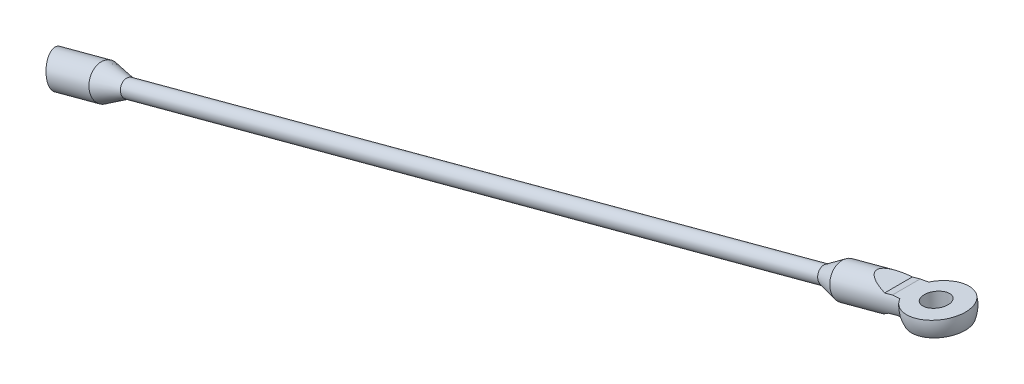
ISO-10303-21;
HEADER;
FILE_DESCRIPTION(('STEP AP214'),'2;1');
FILE_NAME('part.step','',(''),(''),'','','');
FILE_SCHEMA(('AUTOMOTIVE_DESIGN { 1 0 10303 214 1 1 1 1 }'));
ENDSEC;
DATA;
#1=APPLICATION_CONTEXT('core data for automotive mechanical design processes');
#2=APPLICATION_PROTOCOL_DEFINITION('international standard','automotive_design',2000,#1);
#3=PRODUCT_CONTEXT('',#1,'mechanical');
#4=PRODUCT('Part','Part','',(#3));
#5=PRODUCT_RELATED_PRODUCT_CATEGORY('part','',(#4));
#6=PRODUCT_DEFINITION_FORMATION('','',#4);
#7=PRODUCT_DEFINITION_CONTEXT('part definition',#1,'design');
#8=PRODUCT_DEFINITION('design','',#6,#7);
#9=PRODUCT_DEFINITION_SHAPE('','',#8);
#10=(LENGTH_UNIT() NAMED_UNIT(*) SI_UNIT(.MILLI.,.METRE.));
#11=(NAMED_UNIT(*) PLANE_ANGLE_UNIT() SI_UNIT($,.RADIAN.));
#12=(NAMED_UNIT(*) SI_UNIT($,.STERADIAN.) SOLID_ANGLE_UNIT());
#13=UNCERTAINTY_MEASURE_WITH_UNIT(LENGTH_MEASURE(1.E-05),#10,'distance_accuracy_value','');
#14=(GEOMETRIC_REPRESENTATION_CONTEXT(3) GLOBAL_UNCERTAINTY_ASSIGNED_CONTEXT((#13)) GLOBAL_UNIT_ASSIGNED_CONTEXT((#10,
#11,#12)) REPRESENTATION_CONTEXT('',''));
#15=CARTESIAN_POINT('',(0.,0.,0.));
#16=DIRECTION('',(0.,0.,1.));
#17=DIRECTION('',(1.,0.,0.));
#18=AXIS2_PLACEMENT_3D('',#15,#16,#17);
#19=CARTESIAN_POINT('',(1.78943870287719,-13.592136386849,0.));
#20=DIRECTION('',(-0.965925826289068,-0.258819045102522,0.));
#21=DIRECTION('',(0.,0.,1.));
#22=AXIS2_PLACEMENT_3D('',#19,#20,#21);
#23=CYLINDRICAL_SURFACE('',#22,1.);
#24=CARTESIAN_POINT('',(52.320746510658,-0.0523132672655552,0.));
#25=DIRECTION('',(0.965925826289068,0.258819045102522,0.));
#26=DIRECTION('',(0.,0.,1.));
#27=AXIS2_PLACEMENT_3D('',#24,#25,#26);
#28=CIRCLE('',#27,1.);
#29=CARTESIAN_POINT('',(52.320746510658,-0.0523132672655552,1.));
#30=VERTEX_POINT('',#29);
#31=EDGE_CURVE('E132',#30,#30,#28,.T.);
#32=ORIENTED_EDGE('',*,*,#31,.T.);
#33=EDGE_LOOP('',(#32));
#34=FACE_BOUND('',#33,.T.);
#35=CARTESIAN_POINT('',(52.5159822820029,0.,0.));
#36=DIRECTION('',(-0.130526192220052,0.99144486137381,0.));
#37=DIRECTION('',(-0.99144486137381,-0.130526192220052,0.));
#38=AXIS2_PLACEMENT_3D('',#35,#36,#37);
#39=ELLIPSE('',#38,7.66129757554036,1.);
#40=CARTESIAN_POINT('',(56.3138593383655,0.499999999999999,0.86602540378444));
#41=VERTEX_POINT('',#40);
#42=CARTESIAN_POINT('',(56.8138593383655,0.565826248793698,0.824524503078021));
#43=VERTEX_POINT('',#42);
#44=EDGE_CURVE('E127',#41,#43,#39,.T.);
#45=ORIENTED_EDGE('',*,*,#44,.T.);
#46=CARTESIAN_POINT('',(56.6674127289588,1.11237243569579,0.));
#47=DIRECTION('',(0.965925826289068,0.258819045102522,0.));
#48=DIRECTION('',(0.,0.,1.));
#49=AXIS2_PLACEMENT_3D('',#46,#47,#48);
#50=CIRCLE('',#49,1.);
#51=CARTESIAN_POINT('',(56.555040293263,1.53175207508277,0.900829147931753));
#52=VERTEX_POINT('',#51);
#53=EDGE_CURVE('E105',#52,#43,#50,.T.);
#54=ORIENTED_EDGE('',*,*,#53,.F.);
#55=CARTESIAN_POINT('',(59.8529173496255,1.96592582628907,0.));
#56=DIRECTION('',(0.130526192220052,-0.99144486137381,0.));
#57=DIRECTION('',(-0.99144486137381,-0.130526192220052,0.));
#58=AXIS2_PLACEMENT_3D('',#55,#56,#57);
#59=ELLIPSE('',#58,7.66129757554037,1.);
#60=CARTESIAN_POINT('',(56.055040293263,1.46592582628907,0.866025403784439));
#61=VERTEX_POINT('',#60);
#62=EDGE_CURVE('E117',#52,#61,#59,.T.);
#63=ORIENTED_EDGE('',*,*,#62,.T.);
#64=DIRECTION('',(-0.965925826289068,-0.258819045102522,0.));
#65=VECTOR('',#64,1.);
#66=CARTESIAN_POINT('',(1.66002918032593,-13.1091734737044,0.866025403784439));
#67=LINE('',#66,#65);
#68=CARTESIAN_POINT('',(55.5720773801184,1.33651630373781,0.866025403784443));
#69=VERTEX_POINT('',#68);
#70=EDGE_CURVE('E160',#61,#69,#67,.T.);
#71=ORIENTED_EDGE('',*,*,#70,.T.);
#72=CARTESIAN_POINT('',(56.908894185531,1.17707719697142,0.));
#73=DIRECTION('',(-0.118428395398521,-0.992962595047433,0.));
#74=DIRECTION('',(-0.992962595047433,0.118428395398521,0.));
#75=AXIS2_PLACEMENT_3D('',#72,#73,#74);
#76=ELLIPSE('',#75,2.69258240356725,1.);
#77=CARTESIAN_POINT('',(55.5720773801184,1.33651630373781,-0.866025403784443));
#78=VERTEX_POINT('',#77);
#79=EDGE_CURVE('E152',#69,#78,#76,.T.);
#80=ORIENTED_EDGE('',*,*,#79,.T.);
#81=DIRECTION('',(-0.965925826289068,-0.258819045102522,0.));
#82=VECTOR('',#81,1.);
#83=CARTESIAN_POINT('',(1.66002918032593,-13.1091734737044,-0.866025403784439));
#84=LINE('',#83,#82);
#85=CARTESIAN_POINT('',(56.055040293263,1.46592582628907,-0.866025403784439));
#86=VERTEX_POINT('',#85);
#87=EDGE_CURVE('E156',#78,#86,#84,.F.);
#88=ORIENTED_EDGE('',*,*,#87,.T.);
#89=CARTESIAN_POINT('',(56.555040293263,1.53175207508277,-0.900829147931753));
#90=VERTEX_POINT('',#89);
#91=EDGE_CURVE('E124',#86,#90,#59,.T.);
#92=ORIENTED_EDGE('',*,*,#91,.T.);
#93=CARTESIAN_POINT('',(56.8138593383655,0.565826248793698,-0.824524503078021));
#94=VERTEX_POINT('',#93);
#95=EDGE_CURVE('E108',#94,#90,#50,.T.);
#96=ORIENTED_EDGE('',*,*,#95,.F.);
#97=CARTESIAN_POINT('',(56.3138593383655,0.499999999999999,-0.866025403784429));
#98=VERTEX_POINT('',#97);
#99=EDGE_CURVE('E133',#94,#98,#39,.T.);
#100=ORIENTED_EDGE('',*,*,#99,.T.);
#101=DIRECTION('',(-0.965925826289068,-0.258819045102522,0.));
#102=VECTOR('',#101,1.);
#103=CARTESIAN_POINT('',(1.91884822542845,-14.0750992999935,-0.86602540378444));
#104=LINE('',#103,#102);
#105=CARTESIAN_POINT('',(55.830896425221,0.370590477448737,-0.86602540378444));
#106=VERTEX_POINT('',#105);
#107=EDGE_CURVE('E163',#98,#106,#104,.T.);
#108=ORIENTED_EDGE('',*,*,#107,.T.);
#109=CARTESIAN_POINT('',(56.908894185531,1.17707719697142,0.));
#110=DIRECTION('',(-0.599043296468266,0.800716634619535,0.));
#111=DIRECTION('',(-0.800716634619535,-0.599043296468266,0.));
#112=AXIS2_PLACEMENT_3D('',#109,#110,#111);
#113=ELLIPSE('',#112,2.69258240356725,1.);
#114=CARTESIAN_POINT('',(55.830896425221,0.370590477448737,0.866025403784429));
#115=VERTEX_POINT('',#114);
#116=EDGE_CURVE('E167',#106,#115,#113,.T.);
#117=ORIENTED_EDGE('',*,*,#116,.T.);
#118=DIRECTION('',(-0.965925826289068,-0.258819045102522,0.));
#119=VECTOR('',#118,1.);
#120=CARTESIAN_POINT('',(1.91884822542845,-14.0750992999935,0.86602540378444));
#121=LINE('',#120,#119);
#122=EDGE_CURVE('E56',#115,#41,#121,.F.);
#123=ORIENTED_EDGE('',*,*,#122,.T.);
#124=EDGE_LOOP('',(#45,#54,#63,#71,#80,#88,#92,#96,#100,#108,#117,#123));
#125=FACE_BOUND('',#124,.T.);
#126=ADVANCED_FACE('F47',(#34,#125),#23,.T.);
#127=CARTESIAN_POINT('',(58.0546180842154,1.48407299037294,0.));
#128=DIRECTION('',(-0.965925826289068,-0.258819045102522,0.));
#129=DIRECTION('',(0.258819045102522,-0.965925826289068,0.));
#130=AXIS2_PLACEMENT_3D('',#127,#128,#129);
#131=SPHERICAL_SURFACE('',#130,1.75);
#132=CARTESIAN_POINT('',(58.1523090421077,0.74203649518647,0.));
#133=DIRECTION('',(-0.130526192220052,0.99144486137381,0.));
#134=DIRECTION('',(-0.99144486137381,-0.130526192220052,0.));
#135=AXIS2_PLACEMENT_3D('',#132,#133,#134);
#136=CIRCLE('',#135,1.58187809788159);
#137=EDGE_CURVE('E113',#43,#94,#136,.T.);
#138=ORIENTED_EDGE('',*,*,#137,.T.);
#139=ORIENTED_EDGE('',*,*,#95,.T.);
#140=CARTESIAN_POINT('',(58.0228995195564,1.724999408331,0.));
#141=DIRECTION('',(0.130526192220052,-0.99144486137381,0.));
#142=DIRECTION('',(0.99144486137381,0.130526192220052,0.));
#143=AXIS2_PLACEMENT_3D('',#140,#141,#142);
#144=CIRCLE('',#143,1.73304598721034);
#145=EDGE_CURVE('E101',#90,#52,#144,.T.);
#146=ORIENTED_EDGE('',*,*,#145,.T.);
#147=ORIENTED_EDGE('',*,*,#53,.T.);
#148=EDGE_LOOP('',(#138,#139,#146,#147));
#149=FACE_BOUND('',#148,.T.);
#150=ADVANCED_FACE('F103',(#149),#131,.T.);
#151=CARTESIAN_POINT('',(1.78943870287719,-13.592136386849,0.));
#152=DIRECTION('',(-0.965925826289068,-0.258819045102522,0.));
#153=DIRECTION('',(0.,0.,1.));
#154=AXIS2_PLACEMENT_3D('',#151,#152,#153);
#155=CYLINDRICAL_SURFACE('',#154,1.);
#156=CARTESIAN_POINT('',(3.11758671402466,-13.236260199833,0.));
#157=DIRECTION('',(-0.904424534521943,-0.24233982364005,0.351123441588392));
#158=DIRECTION('',(-0.339159200445729,-0.0908774338650186,-0.936329177569044));
#159=AXIS2_PLACEMENT_3D('',#156,#157,#158);
#160=ELLIPSE('',#159,1.06800046816469,1.);
#161=CARTESIAN_POINT('',(2.75536452916626,-13.3333173417464,-1.));
#162=VERTEX_POINT('',#161);
#163=EDGE_CURVE('E11',#162,#162,#160,.T.);
#164=ORIENTED_EDGE('',*,*,#163,.F.);
#165=EDGE_LOOP('',(#164));
#166=FACE_BOUND('',#165,.T.);
#167=CARTESIAN_POINT('',(6.136104921178,-12.4274506838876,0.));
#168=DIRECTION('',(0.965925826289068,0.258819045102522,0.));
#169=DIRECTION('',(0.,0.,1.));
#170=AXIS2_PLACEMENT_3D('',#167,#168,#169);
#171=CIRCLE('',#170,1.);
#172=CARTESIAN_POINT('',(6.136104921178,-12.4274506838876,1.));
#173=VERTEX_POINT('',#172);
#174=EDGE_CURVE('E114',#173,#173,#171,.T.);
#175=ORIENTED_EDGE('',*,*,#174,.F.);
#176=EDGE_LOOP('',(#175));
#177=FACE_BOUND('',#176,.T.);
#178=ADVANCED_FACE('F49',(#166,#177),#155,.T.);
#179=CARTESIAN_POINT('',(7.5849936606116,-12.0392221162338,0.));
#180=DIRECTION('',(-0.965925826289068,-0.258819045102522,0.));
#181=DIRECTION('',(0.,0.,1.));
#182=AXIS2_PLACEMENT_3D('',#179,#180,#181);
#183=CONICAL_SURFACE('',#182,0.5,0.321750554396642);
#184=ORIENTED_EDGE('',*,*,#174,.T.);
#185=EDGE_LOOP('',(#184));
#186=FACE_BOUND('',#185,.T.);
#187=CARTESIAN_POINT('',(7.5849936606116,-12.0392221162338,0.));
#188=DIRECTION('',(0.965925826289068,0.258819045102522,0.));
#189=DIRECTION('',(0.,0.,1.));
#190=AXIS2_PLACEMENT_3D('',#187,#188,#189);
#191=CIRCLE('',#190,0.5);
#192=CARTESIAN_POINT('',(7.5849936606116,-12.0392221162338,0.5));
#193=VERTEX_POINT('',#192);
#194=EDGE_CURVE('E143',#193,#193,#191,.T.);
#195=ORIENTED_EDGE('',*,*,#194,.F.);
#196=EDGE_LOOP('',(#195));
#197=FACE_BOUND('',#196,.T.);
#198=ADVANCED_FACE('F229',(#186,#197),#183,.T.);
#199=CARTESIAN_POINT('',(1.78943870287719,-13.592136386849,0.));
#200=DIRECTION('',(-0.965925826289068,-0.258819045102522,0.));
#201=DIRECTION('',(0.,0.,1.));
#202=AXIS2_PLACEMENT_3D('',#199,#200,#201);
#203=CYLINDRICAL_SURFACE('',#202,0.5);
#204=ORIENTED_EDGE('',*,*,#194,.T.);
#205=EDGE_LOOP('',(#204));
#206=FACE_BOUND('',#205,.T.);
#207=CARTESIAN_POINT('',(51.0516558436197,-0.392365086620345,0.));
#208=DIRECTION('',(0.965925826289068,0.258819045102522,0.));
#209=DIRECTION('',(0.,0.,1.));
#210=AXIS2_PLACEMENT_3D('',#207,#208,#209);
#211=CIRCLE('',#210,0.5);
#212=CARTESIAN_POINT('',(51.0516558436197,-0.392365086620345,0.5));
#213=VERTEX_POINT('',#212);
#214=EDGE_CURVE('E139',#213,#213,#211,.T.);
#215=ORIENTED_EDGE('',*,*,#214,.F.);
#216=EDGE_LOOP('',(#215));
#217=FACE_BOUND('',#216,.T.);
#218=ADVANCED_FACE('F226',(#206,#217),#203,.T.);
#219=CARTESIAN_POINT('',(52.320746510658,-0.0523132672655552,0.));
#220=DIRECTION('',(0.965925826289068,0.258819045102522,0.));
#221=DIRECTION('',(0.,0.,-1.));
#222=AXIS2_PLACEMENT_3D('',#219,#220,#221);
#223=CONICAL_SURFACE('',#222,1.,0.363634722689148);
#224=ORIENTED_EDGE('',*,*,#214,.T.);
#225=EDGE_LOOP('',(#224));
#226=FACE_BOUND('',#225,.T.);
#227=ORIENTED_EDGE('',*,*,#31,.F.);
#228=EDGE_LOOP('',(#227));
#229=FACE_BOUND('',#228,.T.);
#230=ADVANCED_FACE('F222',(#226,#229),#223,.T.);
#231=CARTESIAN_POINT('',(55.5720773801184,1.33651630373781,76.5047755959713));
#232=DIRECTION('',(0.118428395398521,0.992962595047433,0.));
#233=DIRECTION('',(0.992962595047433,-0.118428395398521,0.));
#234=AXIS2_PLACEMENT_3D('',#231,#232,#233);
#235=PLANE('',#234);
#236=ORIENTED_EDGE('',*,*,#79,.F.);
#237=DIRECTION('',(0.,0.,-1.));
#238=VECTOR('',#237,1.);
#239=CARTESIAN_POINT('',(55.5720773801184,1.33651630373781,76.5047755959713));
#240=LINE('',#239,#238);
#241=EDGE_CURVE('E185',#69,#78,#240,.T.);
#242=ORIENTED_EDGE('',*,*,#241,.T.);
#243=EDGE_LOOP('',(#236,#242));
#244=FACE_BOUND('',#243,.T.);
#245=ADVANCED_FACE('F225',(#244),#235,.T.);
#246=CARTESIAN_POINT('',(60.055040293263,1.99253581663865,76.5047755959713));
#247=DIRECTION('',(-0.130526192220052,0.99144486137381,0.));
#248=DIRECTION('',(0.99144486137381,0.130526192220052,0.));
#249=AXIS2_PLACEMENT_3D('',#246,#247,#248);
#250=PLANE('',#249);
#251=CARTESIAN_POINT('',(57.9194783232184,1.71138374952962,0.));
#252=DIRECTION('',(0.130526192220052,-0.99144486137381,0.));
#253=DIRECTION('',(0.99144486137381,0.130526192220052,0.));
#254=AXIS2_PLACEMENT_3D('',#251,#252,#253);
#255=CIRCLE('',#254,0.750000000000002);
#256=CARTESIAN_POINT('',(58.6630619692488,1.80927839369466,0.));
#257=VERTEX_POINT('',#256);
#258=EDGE_CURVE('E188',#257,#257,#255,.T.);
#259=ORIENTED_EDGE('',*,*,#258,.T.);
#260=EDGE_LOOP('',(#259));
#261=FACE_BOUND('',#260,.T.);
#262=DIRECTION('',(0.,0.,-1.));
#263=VECTOR('',#262,1.);
#264=CARTESIAN_POINT('',(56.055040293263,1.46592582628907,76.5047755959713));
#265=LINE('',#264,#263);
#266=EDGE_CURVE('E119',#61,#86,#265,.T.);
#267=ORIENTED_EDGE('',*,*,#266,.F.);
#268=ORIENTED_EDGE('',*,*,#62,.F.);
#269=ORIENTED_EDGE('',*,*,#145,.F.);
#270=ORIENTED_EDGE('',*,*,#91,.F.);
#271=EDGE_LOOP('',(#267,#268,#269,#270));
#272=FACE_BOUND('',#271,.T.);
#273=ADVANCED_FACE('F118',(#261,#272),#250,.T.);
#274=CARTESIAN_POINT('',(56.055040293263,1.46592582628907,76.5047755959713));
#275=DIRECTION('',(-0.258819045102522,0.965925826289068,0.));
#276=DIRECTION('',(0.,0.,-1.));
#277=AXIS2_PLACEMENT_3D('',#274,#275,#276);
#278=PLANE('',#277);
#279=ORIENTED_EDGE('',*,*,#266,.T.);
#280=ORIENTED_EDGE('',*,*,#87,.F.);
#281=ORIENTED_EDGE('',*,*,#241,.F.);
#282=ORIENTED_EDGE('',*,*,#70,.F.);
#283=EDGE_LOOP('',(#279,#280,#281,#282));
#284=FACE_BOUND('',#283,.T.);
#285=ADVANCED_FACE('F296',(#284),#278,.T.);
#286=CARTESIAN_POINT('',(54.7528986649109,-0.435896242073949,76.5047755959713));
#287=DIRECTION('',(0.599043296468266,-0.800716634619535,0.));
#288=DIRECTION('',(-0.800716634619535,-0.599043296468266,0.));
#289=AXIS2_PLACEMENT_3D('',#286,#287,#288);
#290=PLANE('',#289);
#291=ORIENTED_EDGE('',*,*,#116,.F.);
#292=DIRECTION('',(0.,0.,-1.));
#293=VECTOR('',#292,1.);
#294=CARTESIAN_POINT('',(55.830896425221,0.370590477448737,76.5047755959713));
#295=LINE('',#294,#293);
#296=EDGE_CURVE('E70',#115,#106,#295,.T.);
#297=ORIENTED_EDGE('',*,*,#296,.F.);
#298=EDGE_LOOP('',(#291,#297));
#299=FACE_BOUND('',#298,.T.);
#300=ADVANCED_FACE('F301',(#299),#290,.T.);
#301=CARTESIAN_POINT('',(55.830896425221,0.370590477448737,76.5047755959713));
#302=DIRECTION('',(0.258819045102522,-0.965925826289068,0.));
#303=DIRECTION('',(0.,0.,1.));
#304=AXIS2_PLACEMENT_3D('',#301,#302,#303);
#305=PLANE('',#304);
#306=DIRECTION('',(0.,0.,-1.));
#307=VECTOR('',#306,1.);
#308=CARTESIAN_POINT('',(56.3138593383655,0.499999999999999,76.5047755959713));
#309=LINE('',#308,#307);
#310=EDGE_CURVE('E63',#41,#98,#309,.T.);
#311=ORIENTED_EDGE('',*,*,#310,.F.);
#312=ORIENTED_EDGE('',*,*,#122,.F.);
#313=ORIENTED_EDGE('',*,*,#296,.T.);
#314=ORIENTED_EDGE('',*,*,#107,.F.);
#315=EDGE_LOOP('',(#311,#312,#313,#314));
#316=FACE_BOUND('',#315,.T.);
#317=ADVANCED_FACE('F209',(#316),#305,.T.);
#318=CARTESIAN_POINT('',(56.3138593383655,0.499999999999999,76.5047755959713));
#319=DIRECTION('',(0.130526192220052,-0.99144486137381,0.));
#320=DIRECTION('',(-0.99144486137381,-0.130526192220052,0.));
#321=AXIS2_PLACEMENT_3D('',#318,#319,#320);
#322=PLANE('',#321);
#323=CARTESIAN_POINT('',(58.0488878457697,0.72842083638509,0.));
#324=DIRECTION('',(-0.130526192220052,0.991444861373811,0.));
#325=DIRECTION('',(-0.99144486137381,-0.130526192220052,0.));
#326=AXIS2_PLACEMENT_3D('',#323,#324,#325);
#327=CIRCLE('',#326,0.750000000000002);
#328=CARTESIAN_POINT('',(57.3053041997393,0.630526192220051,0.));
#329=VERTEX_POINT('',#328);
#330=EDGE_CURVE('E192',#329,#329,#327,.T.);
#331=ORIENTED_EDGE('',*,*,#330,.T.);
#332=EDGE_LOOP('',(#331));
#333=FACE_BOUND('',#332,.T.);
#334=ORIENTED_EDGE('',*,*,#310,.T.);
#335=ORIENTED_EDGE('',*,*,#99,.F.);
#336=ORIENTED_EDGE('',*,*,#137,.F.);
#337=ORIENTED_EDGE('',*,*,#44,.F.);
#338=EDGE_LOOP('',(#334,#335,#336,#337));
#339=FACE_BOUND('',#338,.T.);
#340=ADVANCED_FACE('F172',(#333,#339),#322,.T.);
#341=CARTESIAN_POINT('',(57.791972463329,2.6798869091808,0.));
#342=DIRECTION('',(0.130526192220052,-0.99144486137381,0.));
#343=DIRECTION('',(-0.99144486137381,-0.130526192220052,0.));
#344=AXIS2_PLACEMENT_3D('',#341,#342,#343);
#345=CYLINDRICAL_SURFACE('',#344,0.750000000000002);
#346=ORIENTED_EDGE('',*,*,#258,.F.);
#347=EDGE_LOOP('',(#346));
#348=FACE_BOUND('',#347,.T.);
#349=ORIENTED_EDGE('',*,*,#330,.F.);
#350=EDGE_LOOP('',(#349));
#351=FACE_BOUND('',#350,.T.);
#352=ADVANCED_FACE('F198',(#348,#351),#345,.F.);
#353=CARTESIAN_POINT('',(1.33185978110239,-8.02072529715656,-1.));
#354=DIRECTION('',(0.904424534521943,0.24233982364005,-0.351123441588392));
#355=DIRECTION('',(-0.339159200445729,-0.0908774338650186,-0.936329177569044));
#356=AXIS2_PLACEMENT_3D('',#353,#354,#355);
#357=PLANE('',#356);
#358=ORIENTED_EDGE('',*,*,#163,.T.);
#359=EDGE_LOOP('',(#358));
#360=FACE_BOUND('',#359,.T.);
#361=ADVANCED_FACE('F200',(#360),#357,.F.);
#362=CLOSED_SHELL('',(#126,#150,#178,#198,#218,#230,#245,#273,#285,#300,#317,#340,#352,#361));
#363=MANIFOLD_SOLID_BREP('B2',#362);
#364=ADVANCED_BREP_SHAPE_REPRESENTATION('',(#18,#363),#14);
#365=SHAPE_DEFINITION_REPRESENTATION(#9,#364);
ENDSEC;
END-ISO-10303-21;
